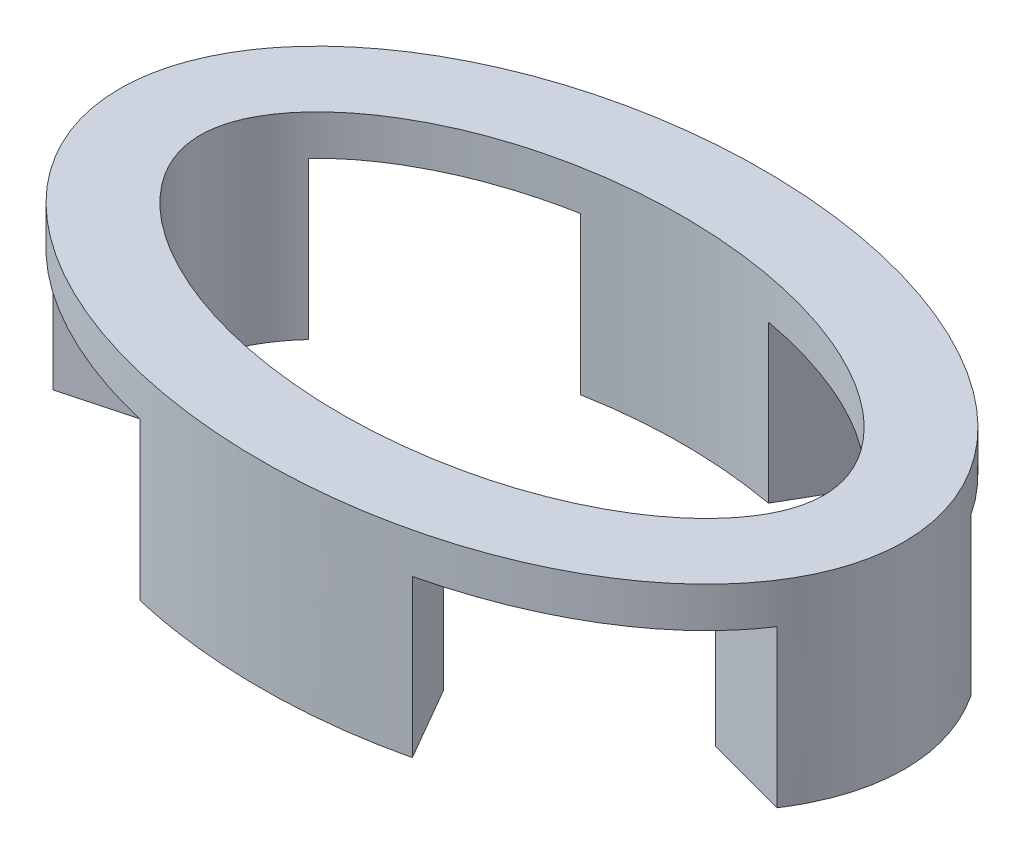
ISO-10303-21;
HEADER;
FILE_DESCRIPTION(('STEP AP214'),'2;1');
FILE_NAME('part.step','',(''),(''),'','','');
FILE_SCHEMA(('AUTOMOTIVE_DESIGN { 1 0 10303 214 1 1 1 1 }'));
ENDSEC;
DATA;
#1=APPLICATION_CONTEXT('core data for automotive mechanical design processes');
#2=APPLICATION_PROTOCOL_DEFINITION('international standard','automotive_design',2000,#1);
#3=PRODUCT_CONTEXT('',#1,'mechanical');
#4=PRODUCT('Part','Part','',(#3));
#5=PRODUCT_RELATED_PRODUCT_CATEGORY('part','',(#4));
#6=PRODUCT_DEFINITION_FORMATION('','',#4);
#7=PRODUCT_DEFINITION_CONTEXT('part definition',#1,'design');
#8=PRODUCT_DEFINITION('design','',#6,#7);
#9=PRODUCT_DEFINITION_SHAPE('','',#8);
#10=(LENGTH_UNIT() NAMED_UNIT(*) SI_UNIT(.MILLI.,.METRE.));
#11=(NAMED_UNIT(*) PLANE_ANGLE_UNIT() SI_UNIT($,.RADIAN.));
#12=(NAMED_UNIT(*) SI_UNIT($,.STERADIAN.) SOLID_ANGLE_UNIT());
#13=UNCERTAINTY_MEASURE_WITH_UNIT(LENGTH_MEASURE(1.E-05),#10,'distance_accuracy_value','');
#14=(GEOMETRIC_REPRESENTATION_CONTEXT(3) GLOBAL_UNCERTAINTY_ASSIGNED_CONTEXT((#13)) GLOBAL_UNIT_ASSIGNED_CONTEXT((#10,
#11,#12)) REPRESENTATION_CONTEXT('',''));
#15=CARTESIAN_POINT('',(0.,0.,0.));
#16=DIRECTION('',(0.,0.,1.));
#17=DIRECTION('',(1.,0.,0.));
#18=AXIS2_PLACEMENT_3D('',#15,#16,#17);
#19=CARTESIAN_POINT('',(0.,3.,0.));
#20=DIRECTION('',(0.,1.,0.));
#21=DIRECTION('',(1.,0.,0.));
#22=AXIS2_PLACEMENT_3D('',#19,#20,#21);
#23=ELLIPSE('',#22,97.5,62.5);
#24=DIRECTION('',(0.,-1.,0.));
#25=VECTOR('',#24,1.);
#26=SURFACE_OF_LINEAR_EXTRUSION('',#23,#25);
#27=CARTESIAN_POINT('',(0.,-3.,0.));
#28=DIRECTION('',(0.,1.,0.));
#29=DIRECTION('',(1.,0.,0.));
#30=AXIS2_PLACEMENT_3D('',#27,#28,#29);
#31=ELLIPSE('',#30,97.5,62.5);
#32=CARTESIAN_POINT('',(97.5,-3.,0.));
#33=VERTEX_POINT('',#32);
#34=EDGE_CURVE('E256',#33,#33,#31,.T.);
#35=ORIENTED_EDGE('',*,*,#34,.F.);
#36=EDGE_LOOP('',(#35));
#37=FACE_BOUND('',#36,.T.);
#38=DIRECTION('',(0.,-1.,0.));
#39=VECTOR('',#38,1.);
#40=CARTESIAN_POINT('',(33.8411131991807,-13.,-58.6145274456705));
#41=LINE('',#40,#39);
#42=CARTESIAN_POINT('',(33.8411131991807,-13.,-58.6145274456705));
#43=VERTEX_POINT('',#42);
#44=CARTESIAN_POINT('',(33.8411131991807,-52.,-58.6145274456705));
#45=VERTEX_POINT('',#44);
#46=EDGE_CURVE('E164',#43,#45,#41,.T.);
#47=ORIENTED_EDGE('',*,*,#46,.T.);
#48=CARTESIAN_POINT('',(0.,-52.,0.));
#49=DIRECTION('',(0.,-1.,0.));
#50=DIRECTION('',(1.,0.,0.));
#51=AXIS2_PLACEMENT_3D('',#48,#49,#50);
#52=ELLIPSE('',#51,97.5,62.5);
#53=CARTESIAN_POINT('',(-33.8411131991807,-52.,-58.6145274456705));
#54=VERTEX_POINT('',#53);
#55=EDGE_CURVE('E557',#54,#45,#52,.T.);
#56=ORIENTED_EDGE('',*,*,#55,.F.);
#57=DIRECTION('',(0.,-1.,0.));
#58=VECTOR('',#57,1.);
#59=CARTESIAN_POINT('',(-33.8411131991807,-13.,-58.6145274456705));
#60=LINE('',#59,#58);
#61=CARTESIAN_POINT('',(-33.8411131991807,-13.,-58.6145274456705));
#62=VERTEX_POINT('',#61);
#63=EDGE_CURVE('E192',#62,#54,#60,.T.);
#64=ORIENTED_EDGE('',*,*,#63,.F.);
#65=CARTESIAN_POINT('',(0.,-13.,0.));
#66=DIRECTION('',(0.,1.,0.));
#67=DIRECTION('',(1.,0.,0.));
#68=AXIS2_PLACEMENT_3D('',#65,#66,#67);
#69=ELLIPSE('',#68,97.5,62.5);
#70=CARTESIAN_POINT('',(-89.9573349148752,-13.,-24.1039952436969));
#71=VERTEX_POINT('',#70);
#72=EDGE_CURVE('E199',#71,#62,#69,.F.);
#73=ORIENTED_EDGE('',*,*,#72,.F.);
#74=DIRECTION('',(0.,-1.,0.));
#75=VECTOR('',#74,1.);
#76=CARTESIAN_POINT('',(-89.9573349148752,-27.5,-24.1039952436969));
#77=LINE('',#76,#75);
#78=CARTESIAN_POINT('',(-89.9573349148752,-52.,-24.1039952436969));
#79=VERTEX_POINT('',#78);
#80=EDGE_CURVE('E202',#71,#79,#77,.T.);
#81=ORIENTED_EDGE('',*,*,#80,.T.);
#82=CARTESIAN_POINT('',(-89.9573349148752,-52.,24.1039952436969));
#83=VERTEX_POINT('',#82);
#84=EDGE_CURVE('E333',#83,#79,#52,.T.);
#85=ORIENTED_EDGE('',*,*,#84,.F.);
#86=DIRECTION('',(0.,-1.,0.));
#87=VECTOR('',#86,1.);
#88=CARTESIAN_POINT('',(-89.9573349148752,-27.5,24.1039952436969));
#89=LINE('',#88,#87);
#90=CARTESIAN_POINT('',(-89.9573349148752,-13.,24.1039952436969));
#91=VERTEX_POINT('',#90);
#92=EDGE_CURVE('E229',#91,#83,#89,.T.);
#93=ORIENTED_EDGE('',*,*,#92,.F.);
#94=CARTESIAN_POINT('',(0.,-13.,0.));
#95=DIRECTION('',(0.,1.,0.));
#96=DIRECTION('',(1.,0.,0.));
#97=AXIS2_PLACEMENT_3D('',#94,#95,#96);
#98=ELLIPSE('',#97,97.5,62.5);
#99=CARTESIAN_POINT('',(-33.8411131991807,-13.,58.6145274456705));
#100=VERTEX_POINT('',#99);
#101=EDGE_CURVE('E226',#100,#91,#98,.F.);
#102=ORIENTED_EDGE('',*,*,#101,.F.);
#103=DIRECTION('',(0.,-1.,0.));
#104=VECTOR('',#103,1.);
#105=CARTESIAN_POINT('',(-33.8411131991807,-13.,58.6145274456705));
#106=LINE('',#105,#104);
#107=CARTESIAN_POINT('',(-33.8411131991807,-52.,58.6145274456705));
#108=VERTEX_POINT('',#107);
#109=EDGE_CURVE('E216',#100,#108,#106,.T.);
#110=ORIENTED_EDGE('',*,*,#109,.T.);
#111=CARTESIAN_POINT('',(33.8411131991807,-52.,58.6145274456705));
#112=VERTEX_POINT('',#111);
#113=EDGE_CURVE('E396',#112,#108,#52,.T.);
#114=ORIENTED_EDGE('',*,*,#113,.F.);
#115=DIRECTION('',(0.,-1.,0.));
#116=VECTOR('',#115,1.);
#117=CARTESIAN_POINT('',(33.8411131991807,-13.,58.6145274456705));
#118=LINE('',#117,#116);
#119=CARTESIAN_POINT('',(33.8411131991807,-13.,58.6145274456705));
#120=VERTEX_POINT('',#119);
#121=EDGE_CURVE('E241',#120,#112,#118,.T.);
#122=ORIENTED_EDGE('',*,*,#121,.F.);
#123=CARTESIAN_POINT('',(0.,-13.,0.));
#124=DIRECTION('',(0.,1.,0.));
#125=DIRECTION('',(1.,0.,0.));
#126=AXIS2_PLACEMENT_3D('',#123,#124,#125);
#127=ELLIPSE('',#126,97.5,62.5);
#128=CARTESIAN_POINT('',(89.9573349148752,-13.,24.1039952436969));
#129=VERTEX_POINT('',#128);
#130=EDGE_CURVE('E249',#129,#120,#127,.F.);
#131=ORIENTED_EDGE('',*,*,#130,.F.);
#132=DIRECTION('',(0.,-1.,0.));
#133=VECTOR('',#132,1.);
#134=CARTESIAN_POINT('',(89.9573349148752,-27.5,24.1039952436969));
#135=LINE('',#134,#133);
#136=CARTESIAN_POINT('',(89.9573349148752,-52.,24.1039952436969));
#137=VERTEX_POINT('',#136);
#138=EDGE_CURVE('E252',#129,#137,#135,.T.);
#139=ORIENTED_EDGE('',*,*,#138,.T.);
#140=CARTESIAN_POINT('',(89.9573349148752,-52.,-24.1039952436969));
#141=VERTEX_POINT('',#140);
#142=EDGE_CURVE('E268',#141,#137,#52,.T.);
#143=ORIENTED_EDGE('',*,*,#142,.F.);
#144=DIRECTION('',(0.,-1.,0.));
#145=VECTOR('',#144,1.);
#146=CARTESIAN_POINT('',(89.9573349148752,-27.5,-24.1039952436969));
#147=LINE('',#146,#145);
#148=CARTESIAN_POINT('',(89.9573349148752,-13.,-24.1039952436969));
#149=VERTEX_POINT('',#148);
#150=EDGE_CURVE('E177',#149,#141,#147,.T.);
#151=ORIENTED_EDGE('',*,*,#150,.F.);
#152=CARTESIAN_POINT('',(0.,-13.,0.));
#153=DIRECTION('',(0.,1.,0.));
#154=DIRECTION('',(1.,0.,0.));
#155=AXIS2_PLACEMENT_3D('',#152,#153,#154);
#156=ELLIPSE('',#155,97.5,62.5);
#157=EDGE_CURVE('E159',#43,#149,#156,.F.);
#158=ORIENTED_EDGE('',*,*,#157,.F.);
#159=EDGE_LOOP('',(#47,#56,#64,#73,#81,#85,#93,#102,#110,#114,#122,#131,#139,#143,#151,#158));
#160=FACE_BOUND('',#159,.T.);
#161=ADVANCED_FACE('F43',(#37,#160),#26,.F.);
#162=CARTESIAN_POINT('',(0.,-52.,0.));
#163=DIRECTION('',(0.,-1.,0.));
#164=DIRECTION('',(0.,0.,-1.));
#165=AXIS2_PLACEMENT_3D('',#162,#163,#164);
#166=PLANE('',#165);
#167=ORIENTED_EDGE('',*,*,#55,.T.);
#168=DIRECTION('',(-0.500000000000001,0.,0.866025403784438));
#169=VECTOR('',#168,1.);
#170=CARTESIAN_POINT('',(33.8411131991807,-52.,-58.6145274456705));
#171=LINE('',#170,#169);
#172=CARTESIAN_POINT('',(23.3195355276156,-52.,-40.3906203427376));
#173=VERTEX_POINT('',#172);
#174=EDGE_CURVE('E169',#45,#173,#171,.T.);
#175=ORIENTED_EDGE('',*,*,#174,.T.);
#176=CARTESIAN_POINT('',(77.5,-52.,0.));
#177=CARTESIAN_POINT('',(77.5,-52.,2.05153029392787));
#178=CARTESIAN_POINT('',(76.896839649338,-52.,6.15459088178361));
#179=CARTESIAN_POINT('',(73.7614064019966,-52.,12.9769434983319));
#180=CARTESIAN_POINT('',(67.7379482689495,-52.,20.3167028975504));
#181=CARTESIAN_POINT('',(58.621429311724,-52.,27.5010369489446));
#182=CARTESIAN_POINT('',(46.6738677118328,-52.,33.8186955759619));
#183=CARTESIAN_POINT('',(27.7018251632302,-52.,40.3508722503388));
#184=CARTESIAN_POINT('',(0.,-52.,43.9327518331075));
#185=CARTESIAN_POINT('',(-27.7018251632302,-52.,40.3508722503388));
#186=CARTESIAN_POINT('',(-46.6738677118328,-52.,33.8186955759619));
#187=CARTESIAN_POINT('',(-58.621429311724,-52.,27.5010369489445));
#188=CARTESIAN_POINT('',(-67.7379482689496,-52.,20.3167028975504));
#189=CARTESIAN_POINT('',(-73.7614064019966,-52.,12.9769434983319));
#190=CARTESIAN_POINT('',(-76.896839649338,-52.,6.15459088178362));
#191=CARTESIAN_POINT('',(-77.801580175331,-52.,0.));
#192=CARTESIAN_POINT('',(-76.896839649338,-52.,-6.15459088178361));
#193=CARTESIAN_POINT('',(-73.7614064019966,-52.,-12.9769434983319));
#194=CARTESIAN_POINT('',(-67.7379482689496,-52.,-20.3167028975503));
#195=CARTESIAN_POINT('',(-58.6214293117241,-52.,-27.5010369489446));
#196=CARTESIAN_POINT('',(-46.6738677118328,-52.,-33.8186955759618));
#197=CARTESIAN_POINT('',(-27.7018251632302,-52.,-40.3508722503388));
#198=CARTESIAN_POINT('',(0.,-52.,-43.9327518331075));
#199=CARTESIAN_POINT('',(27.7018251632302,-52.,-40.3508722503388));
#200=CARTESIAN_POINT('',(46.6738677118328,-52.,-33.8186955759619));
#201=CARTESIAN_POINT('',(58.621429311724,-52.,-27.5010369489446));
#202=CARTESIAN_POINT('',(67.7379482689495,-52.,-20.3167028975504));
#203=CARTESIAN_POINT('',(73.7614064019966,-52.,-12.9769434983319));
#204=CARTESIAN_POINT('',(76.8968396493379,-52.,-6.15459088178363));
#205=CARTESIAN_POINT('',(77.5,-52.,-2.05153029392788));
#206=CARTESIAN_POINT('',(77.5,-52.,0.));
#207=B_SPLINE_CURVE_WITH_KNOTS('',3,(#176,#177,#178,#179,#180,#181,#182,#183,#184,#185,#186,
#187,#188,#189,#190,#191,#192,#193,#194,#195,#196,#197,#198,#199,#200,#201,#202,#203,#204,#205,
#206),.UNSPECIFIED.,.T.,.F.,(4,1,1,1,1,1,1,1,1,1,1,1,1,1,1,1,1,1,1,1,1,1,1,1,1,1,1,1,4),(0.,
0.196349540849362,0.392699081698724,0.589048622548086,0.785398163397448,0.98174770424681,
1.17809724509617,1.5707963267949,1.96349540849362,2.15984494934298,2.35619449019234,
2.55254403104171,2.74889357189107,2.94524311274043,3.14159265358979,3.33794219443916,
3.53429173528852,3.73064127613788,3.92699081698724,4.1233403578366,4.31968989868597,
4.71238898038469,5.10508806208341,5.30143760293278,5.49778714378214,5.6941366846315,
5.89048622548086,6.08683576633022,6.28318530717959),.UNSPECIFIED.);
#208=CARTESIAN_POINT('',(-23.3195355288909,-52.,-40.3906203449464));
#209=VERTEX_POINT('',#208);
#210=EDGE_CURVE('E310',#209,#173,#207,.T.);
#211=ORIENTED_EDGE('',*,*,#210,.F.);
#212=DIRECTION('',(0.500000000000001,0.,0.866025403784438));
#213=VECTOR('',#212,1.);
#214=CARTESIAN_POINT('',(-33.8411131991807,-52.,-58.6145274456705));
#215=LINE('',#214,#213);
#216=EDGE_CURVE('E181',#54,#209,#215,.T.);
#217=ORIENTED_EDGE('',*,*,#216,.F.);
#218=EDGE_LOOP('',(#167,#175,#211,#217));
#219=FACE_BOUND('',#218,.T.);
#220=ADVANCED_FACE('F289',(#219),#166,.T.);
#221=CARTESIAN_POINT('',(69.0028461434898,-52.,-18.4892568995971));
#222=VERTEX_POINT('',#221);
#223=CARTESIAN_POINT('',(69.0028461434898,-52.,18.4892568995971));
#224=VERTEX_POINT('',#223);
#225=EDGE_CURVE('E270',#222,#224,#207,.T.);
#226=ORIENTED_EDGE('',*,*,#225,.F.);
#227=DIRECTION('',(0.965925826289068,0.,-0.258819045102521));
#228=VECTOR('',#227,1.);
#229=CARTESIAN_POINT('',(54.6654774091832,-52.,-14.6475705256524));
#230=LINE('',#229,#228);
#231=EDGE_CURVE('E374',#222,#141,#230,.T.);
#232=ORIENTED_EDGE('',*,*,#231,.T.);
#233=ORIENTED_EDGE('',*,*,#142,.T.);
#234=DIRECTION('',(0.965925826289068,0.,0.258819045102521));
#235=VECTOR('',#234,1.);
#236=CARTESIAN_POINT('',(54.6654774091832,-52.,14.6475705256524));
#237=LINE('',#236,#235);
#238=EDGE_CURVE('E237',#224,#137,#237,.T.);
#239=ORIENTED_EDGE('',*,*,#238,.F.);
#240=EDGE_LOOP('',(#226,#232,#233,#239));
#241=FACE_BOUND('',#240,.T.);
#242=ADVANCED_FACE('F282',(#241),#166,.T.);
#243=DIRECTION('',(0.,1.,0.));
#244=VECTOR('',#243,1.);
#245=SURFACE_OF_LINEAR_EXTRUSION('',#207,#244);
#246=CARTESIAN_POINT('',(77.5,-3.,0.));
#247=CARTESIAN_POINT('',(77.5,-3.,2.05153029392787));
#248=CARTESIAN_POINT('',(76.896839649338,-3.,6.15459088178361));
#249=CARTESIAN_POINT('',(73.7614064019966,-3.,12.9769434983319));
#250=CARTESIAN_POINT('',(67.7379482689495,-3.,20.3167028975504));
#251=CARTESIAN_POINT('',(58.621429311724,-3.,27.5010369489446));
#252=CARTESIAN_POINT('',(46.6738677118328,-3.,33.8186955759619));
#253=CARTESIAN_POINT('',(27.7018251632302,-3.,40.3508722503388));
#254=CARTESIAN_POINT('',(0.,-3.,43.9327518331075));
#255=CARTESIAN_POINT('',(-27.7018251632302,-3.,40.3508722503388));
#256=CARTESIAN_POINT('',(-46.6738677118328,-3.,33.8186955759619));
#257=CARTESIAN_POINT('',(-58.621429311724,-3.,27.5010369489445));
#258=CARTESIAN_POINT('',(-67.7379482689496,-3.,20.3167028975504));
#259=CARTESIAN_POINT('',(-73.7614064019966,-3.,12.9769434983319));
#260=CARTESIAN_POINT('',(-76.896839649338,-3.,6.15459088178362));
#261=CARTESIAN_POINT('',(-77.801580175331,-3.,0.));
#262=CARTESIAN_POINT('',(-76.896839649338,-3.,-6.15459088178361));
#263=CARTESIAN_POINT('',(-73.7614064019966,-3.,-12.9769434983319));
#264=CARTESIAN_POINT('',(-67.7379482689496,-3.,-20.3167028975503));
#265=CARTESIAN_POINT('',(-58.6214293117241,-3.,-27.5010369489446));
#266=CARTESIAN_POINT('',(-46.6738677118328,-3.,-33.8186955759618));
#267=CARTESIAN_POINT('',(-27.7018251632302,-3.,-40.3508722503388));
#268=CARTESIAN_POINT('',(0.,-3.,-43.9327518331075));
#269=CARTESIAN_POINT('',(27.7018251632302,-3.,-40.3508722503388));
#270=CARTESIAN_POINT('',(46.6738677118328,-3.,-33.8186955759619));
#271=CARTESIAN_POINT('',(58.621429311724,-3.,-27.5010369489446));
#272=CARTESIAN_POINT('',(67.7379482689495,-3.,-20.3167028975504));
#273=CARTESIAN_POINT('',(73.7614064019966,-3.,-12.9769434983319));
#274=CARTESIAN_POINT('',(76.8968396493379,-3.,-6.15459088178363));
#275=CARTESIAN_POINT('',(77.5,-3.,-2.05153029392788));
#276=CARTESIAN_POINT('',(77.5,-3.,0.));
#277=B_SPLINE_CURVE_WITH_KNOTS('',3,(#246,#247,#248,#249,#250,#251,#252,#253,#254,#255,#256,
#257,#258,#259,#260,#261,#262,#263,#264,#265,#266,#267,#268,#269,#270,#271,#272,#273,#274,#275,
#276),.UNSPECIFIED.,.T.,.F.,(4,1,1,1,1,1,1,1,1,1,1,1,1,1,1,1,1,1,1,1,1,1,1,1,1,1,1,1,4),(0.,
0.196349540849362,0.392699081698724,0.589048622548086,0.785398163397448,0.98174770424681,
1.17809724509617,1.5707963267949,1.96349540849362,2.15984494934298,2.35619449019234,
2.55254403104171,2.74889357189107,2.94524311274043,3.14159265358979,3.33794219443916,
3.53429173528852,3.73064127613788,3.92699081698724,4.1233403578366,4.31968989868597,
4.71238898038469,5.10508806208341,5.30143760293278,5.49778714378214,5.6941366846315,
5.89048622548086,6.08683576633022,6.28318530717959),.UNSPECIFIED.);
#278=CARTESIAN_POINT('',(77.5,-3.,0.));
#279=VERTEX_POINT('',#278);
#280=EDGE_CURVE('E260',#279,#279,#277,.T.);
#281=ORIENTED_EDGE('',*,*,#280,.F.);
#282=EDGE_LOOP('',(#281));
#283=FACE_BOUND('',#282,.T.);
#284=ORIENTED_EDGE('',*,*,#210,.T.);
#285=DIRECTION('',(0.,1.,0.));
#286=VECTOR('',#285,1.);
#287=CARTESIAN_POINT('',(23.3195355268599,-52.,-40.3906203414288));
#288=LINE('',#287,#286);
#289=CARTESIAN_POINT('',(23.3195355276156,-13.,-40.3906203427376));
#290=VERTEX_POINT('',#289);
#291=EDGE_CURVE('E11',#173,#290,#288,.T.);
#292=ORIENTED_EDGE('',*,*,#291,.T.);
#293=CARTESIAN_POINT('',(77.5,-13.,0.));
#294=CARTESIAN_POINT('',(77.5,-13.,2.05153029392787));
#295=CARTESIAN_POINT('',(76.896839649338,-13.,6.15459088178361));
#296=CARTESIAN_POINT('',(73.7614064019966,-13.,12.9769434983319));
#297=CARTESIAN_POINT('',(67.7379482689495,-13.,20.3167028975504));
#298=CARTESIAN_POINT('',(58.621429311724,-13.,27.5010369489446));
#299=CARTESIAN_POINT('',(46.6738677118328,-13.,33.8186955759619));
#300=CARTESIAN_POINT('',(27.7018251632302,-13.,40.3508722503388));
#301=CARTESIAN_POINT('',(0.,-13.,43.9327518331075));
#302=CARTESIAN_POINT('',(-27.7018251632302,-13.,40.3508722503388));
#303=CARTESIAN_POINT('',(-46.6738677118328,-13.,33.8186955759619));
#304=CARTESIAN_POINT('',(-58.621429311724,-13.,27.5010369489445));
#305=CARTESIAN_POINT('',(-67.7379482689496,-13.,20.3167028975504));
#306=CARTESIAN_POINT('',(-73.7614064019966,-13.,12.9769434983319));
#307=CARTESIAN_POINT('',(-76.896839649338,-13.,6.15459088178362));
#308=CARTESIAN_POINT('',(-77.801580175331,-13.,0.));
#309=CARTESIAN_POINT('',(-76.896839649338,-13.,-6.15459088178361));
#310=CARTESIAN_POINT('',(-73.7614064019966,-13.,-12.9769434983319));
#311=CARTESIAN_POINT('',(-67.7379482689496,-13.,-20.3167028975503));
#312=CARTESIAN_POINT('',(-58.6214293117241,-13.,-27.5010369489446));
#313=CARTESIAN_POINT('',(-46.6738677118328,-13.,-33.8186955759618));
#314=CARTESIAN_POINT('',(-27.7018251632302,-13.,-40.3508722503388));
#315=CARTESIAN_POINT('',(0.,-13.,-43.9327518331075));
#316=CARTESIAN_POINT('',(27.7018251632302,-13.,-40.3508722503388));
#317=CARTESIAN_POINT('',(46.6738677118328,-13.,-33.8186955759619));
#318=CARTESIAN_POINT('',(58.621429311724,-13.,-27.5010369489446));
#319=CARTESIAN_POINT('',(67.7379482689495,-13.,-20.3167028975504));
#320=CARTESIAN_POINT('',(73.7614064019966,-13.,-12.9769434983319));
#321=CARTESIAN_POINT('',(76.8968396493379,-13.,-6.15459088178363));
#322=CARTESIAN_POINT('',(77.5,-13.,-2.05153029392788));
#323=CARTESIAN_POINT('',(77.5,-13.,0.));
#324=B_SPLINE_CURVE_WITH_KNOTS('',3,(#293,#294,#295,#296,#297,#298,#299,#300,#301,#302,#303,
#304,#305,#306,#307,#308,#309,#310,#311,#312,#313,#314,#315,#316,#317,#318,#319,#320,#321,#322,
#323),.UNSPECIFIED.,.T.,.F.,(4,1,1,1,1,1,1,1,1,1,1,1,1,1,1,1,1,1,1,1,1,1,1,1,1,1,1,1,4),(0.,
0.196349540849362,0.392699081698724,0.589048622548086,0.785398163397448,0.98174770424681,
1.17809724509617,1.5707963267949,1.96349540849362,2.15984494934298,2.35619449019234,
2.55254403104171,2.74889357189107,2.94524311274043,3.14159265358979,3.33794219443916,
3.53429173528852,3.73064127613788,3.92699081698724,4.1233403578366,4.31968989868597,
4.71238898038469,5.10508806208341,5.30143760293278,5.49778714378214,5.6941366846315,
5.89048622548086,6.08683576633022,6.28318530717959),.UNSPECIFIED.);
#325=CARTESIAN_POINT('',(69.0028461434896,-13.,-18.4892568995977));
#326=VERTEX_POINT('',#325);
#327=EDGE_CURVE('E161',#290,#326,#324,.T.);
#328=ORIENTED_EDGE('',*,*,#327,.T.);
#329=DIRECTION('',(0.,1.,0.));
#330=VECTOR('',#329,1.);
#331=CARTESIAN_POINT('',(69.0028461434901,-52.,-18.4892568995972));
#332=LINE('',#331,#330);
#333=EDGE_CURVE('E52',#326,#222,#332,.F.);
#334=ORIENTED_EDGE('',*,*,#333,.T.);
#335=ORIENTED_EDGE('',*,*,#225,.T.);
#336=DIRECTION('',(0.,1.,0.));
#337=VECTOR('',#336,1.);
#338=CARTESIAN_POINT('',(69.0028461434901,-52.,18.4892568995972));
#339=LINE('',#338,#337);
#340=CARTESIAN_POINT('',(69.0028461434898,-13.,18.4892568995971));
#341=VERTEX_POINT('',#340);
#342=EDGE_CURVE('E377',#341,#224,#339,.F.);
#343=ORIENTED_EDGE('',*,*,#342,.F.);
#344=CARTESIAN_POINT('',(77.5,-13.,0.));
#345=CARTESIAN_POINT('',(77.5,-13.,2.05153029392787));
#346=CARTESIAN_POINT('',(76.896839649338,-13.,6.15459088178361));
#347=CARTESIAN_POINT('',(73.7614064019966,-13.,12.9769434983319));
#348=CARTESIAN_POINT('',(67.7379482689495,-13.,20.3167028975504));
#349=CARTESIAN_POINT('',(58.621429311724,-13.,27.5010369489446));
#350=CARTESIAN_POINT('',(46.6738677118328,-13.,33.8186955759619));
#351=CARTESIAN_POINT('',(27.7018251632302,-13.,40.3508722503388));
#352=CARTESIAN_POINT('',(0.,-13.,43.9327518331075));
#353=CARTESIAN_POINT('',(-27.7018251632302,-13.,40.3508722503388));
#354=CARTESIAN_POINT('',(-46.6738677118328,-13.,33.8186955759619));
#355=CARTESIAN_POINT('',(-58.621429311724,-13.,27.5010369489445));
#356=CARTESIAN_POINT('',(-67.7379482689496,-13.,20.3167028975504));
#357=CARTESIAN_POINT('',(-73.7614064019966,-13.,12.9769434983319));
#358=CARTESIAN_POINT('',(-76.896839649338,-13.,6.15459088178362));
#359=CARTESIAN_POINT('',(-77.801580175331,-13.,0.));
#360=CARTESIAN_POINT('',(-76.896839649338,-13.,-6.15459088178361));
#361=CARTESIAN_POINT('',(-73.7614064019966,-13.,-12.9769434983319));
#362=CARTESIAN_POINT('',(-67.7379482689496,-13.,-20.3167028975503));
#363=CARTESIAN_POINT('',(-58.6214293117241,-13.,-27.5010369489446));
#364=CARTESIAN_POINT('',(-46.6738677118328,-13.,-33.8186955759618));
#365=CARTESIAN_POINT('',(-27.7018251632302,-13.,-40.3508722503388));
#366=CARTESIAN_POINT('',(0.,-13.,-43.9327518331075));
#367=CARTESIAN_POINT('',(27.7018251632302,-13.,-40.3508722503388));
#368=CARTESIAN_POINT('',(46.6738677118328,-13.,-33.8186955759619));
#369=CARTESIAN_POINT('',(58.621429311724,-13.,-27.5010369489446));
#370=CARTESIAN_POINT('',(67.7379482689495,-13.,-20.3167028975504));
#371=CARTESIAN_POINT('',(73.7614064019966,-13.,-12.9769434983319));
#372=CARTESIAN_POINT('',(76.8968396493379,-13.,-6.15459088178363));
#373=CARTESIAN_POINT('',(77.5,-13.,-2.05153029392788));
#374=CARTESIAN_POINT('',(77.5,-13.,0.));
#375=B_SPLINE_CURVE_WITH_KNOTS('',3,(#344,#345,#346,#347,#348,#349,#350,#351,#352,#353,#354,
#355,#356,#357,#358,#359,#360,#361,#362,#363,#364,#365,#366,#367,#368,#369,#370,#371,#372,#373,
#374),.UNSPECIFIED.,.T.,.F.,(4,1,1,1,1,1,1,1,1,1,1,1,1,1,1,1,1,1,1,1,1,1,1,1,1,1,1,1,4),(0.,
0.196349540849362,0.392699081698724,0.589048622548086,0.785398163397448,0.98174770424681,
1.17809724509617,1.5707963267949,1.96349540849362,2.15984494934298,2.35619449019234,
2.55254403104171,2.74889357189107,2.94524311274043,3.14159265358979,3.33794219443916,
3.53429173528852,3.73064127613788,3.92699081698724,4.1233403578366,4.31968989868597,
4.71238898038469,5.10508806208341,5.30143760293278,5.49778714378214,5.6941366846315,
5.89048622548086,6.08683576633022,6.28318530717959),.UNSPECIFIED.);
#376=CARTESIAN_POINT('',(23.3195355312932,-13.,40.3906203406143));
#377=VERTEX_POINT('',#376);
#378=EDGE_CURVE('E393',#341,#377,#375,.T.);
#379=ORIENTED_EDGE('',*,*,#378,.T.);
#380=DIRECTION('',(0.,1.,0.));
#381=VECTOR('',#380,1.);
#382=CARTESIAN_POINT('',(23.3195355268599,-52.,40.3906203414288));
#383=LINE('',#382,#381);
#384=CARTESIAN_POINT('',(23.3195355276156,-52.,40.3906203427376));
#385=VERTEX_POINT('',#384);
#386=EDGE_CURVE('E389',#385,#377,#383,.T.);
#387=ORIENTED_EDGE('',*,*,#386,.F.);
#388=CARTESIAN_POINT('',(-23.3195355288909,-52.,40.3906203449464));
#389=VERTEX_POINT('',#388);
#390=EDGE_CURVE('E261',#385,#389,#207,.T.);
#391=ORIENTED_EDGE('',*,*,#390,.T.);
#392=DIRECTION('',(0.,1.,0.));
#393=VECTOR('',#392,1.);
#394=CARTESIAN_POINT('',(-23.31953552686,-52.,40.3906203414288));
#395=LINE('',#394,#393);
#396=CARTESIAN_POINT('',(-23.3195355288909,-13.,40.3906203449464));
#397=VERTEX_POINT('',#396);
#398=EDGE_CURVE('E349',#389,#397,#395,.T.);
#399=ORIENTED_EDGE('',*,*,#398,.T.);
#400=CARTESIAN_POINT('',(77.5,-13.,0.));
#401=CARTESIAN_POINT('',(77.5,-13.,2.05153029392787));
#402=CARTESIAN_POINT('',(76.896839649338,-13.,6.15459088178361));
#403=CARTESIAN_POINT('',(73.7614064019966,-13.,12.9769434983319));
#404=CARTESIAN_POINT('',(67.7379482689495,-13.,20.3167028975504));
#405=CARTESIAN_POINT('',(58.621429311724,-13.,27.5010369489446));
#406=CARTESIAN_POINT('',(46.6738677118328,-13.,33.8186955759619));
#407=CARTESIAN_POINT('',(27.7018251632302,-13.,40.3508722503388));
#408=CARTESIAN_POINT('',(0.,-13.,43.9327518331075));
#409=CARTESIAN_POINT('',(-27.7018251632302,-13.,40.3508722503388));
#410=CARTESIAN_POINT('',(-46.6738677118328,-13.,33.8186955759619));
#411=CARTESIAN_POINT('',(-58.621429311724,-13.,27.5010369489445));
#412=CARTESIAN_POINT('',(-67.7379482689496,-13.,20.3167028975504));
#413=CARTESIAN_POINT('',(-73.7614064019966,-13.,12.9769434983319));
#414=CARTESIAN_POINT('',(-76.896839649338,-13.,6.15459088178362));
#415=CARTESIAN_POINT('',(-77.801580175331,-13.,0.));
#416=CARTESIAN_POINT('',(-76.896839649338,-13.,-6.15459088178361));
#417=CARTESIAN_POINT('',(-73.7614064019966,-13.,-12.9769434983319));
#418=CARTESIAN_POINT('',(-67.7379482689496,-13.,-20.3167028975503));
#419=CARTESIAN_POINT('',(-58.6214293117241,-13.,-27.5010369489446));
#420=CARTESIAN_POINT('',(-46.6738677118328,-13.,-33.8186955759618));
#421=CARTESIAN_POINT('',(-27.7018251632302,-13.,-40.3508722503388));
#422=CARTESIAN_POINT('',(0.,-13.,-43.9327518331075));
#423=CARTESIAN_POINT('',(27.7018251632302,-13.,-40.3508722503388));
#424=CARTESIAN_POINT('',(46.6738677118328,-13.,-33.8186955759619));
#425=CARTESIAN_POINT('',(58.621429311724,-13.,-27.5010369489446));
#426=CARTESIAN_POINT('',(67.7379482689495,-13.,-20.3167028975504));
#427=CARTESIAN_POINT('',(73.7614064019966,-13.,-12.9769434983319));
#428=CARTESIAN_POINT('',(76.8968396493379,-13.,-6.15459088178363));
#429=CARTESIAN_POINT('',(77.5,-13.,-2.05153029392788));
#430=CARTESIAN_POINT('',(77.5,-13.,0.));
#431=B_SPLINE_CURVE_WITH_KNOTS('',3,(#400,#401,#402,#403,#404,#405,#406,#407,#408,#409,#410,
#411,#412,#413,#414,#415,#416,#417,#418,#419,#420,#421,#422,#423,#424,#425,#426,#427,#428,#429,
#430),.UNSPECIFIED.,.T.,.F.,(4,1,1,1,1,1,1,1,1,1,1,1,1,1,1,1,1,1,1,1,1,1,1,1,1,1,1,1,4),(0.,
0.196349540849362,0.392699081698724,0.589048622548086,0.785398163397448,0.98174770424681,
1.17809724509617,1.5707963267949,1.96349540849362,2.15984494934298,2.35619449019234,
2.55254403104171,2.74889357189107,2.94524311274043,3.14159265358979,3.33794219443916,
3.53429173528852,3.73064127613788,3.92699081698724,4.1233403578366,4.31968989868597,
4.71238898038469,5.10508806208341,5.30143760293278,5.49778714378214,5.6941366846315,
5.89048622548086,6.08683576633022,6.28318530717959),.UNSPECIFIED.);
#432=CARTESIAN_POINT('',(-69.0028461488652,-13.,18.4892568938514));
#433=VERTEX_POINT('',#432);
#434=EDGE_CURVE('E408',#397,#433,#431,.T.);
#435=ORIENTED_EDGE('',*,*,#434,.T.);
#436=DIRECTION('',(0.,1.,0.));
#437=VECTOR('',#436,1.);
#438=CARTESIAN_POINT('',(-69.0028461434901,-52.,18.4892568995972));
#439=LINE('',#438,#437);
#440=CARTESIAN_POINT('',(-69.0028461470687,-52.,18.4892569005561));
#441=VERTEX_POINT('',#440);
#442=EDGE_CURVE('E329',#433,#441,#439,.F.);
#443=ORIENTED_EDGE('',*,*,#442,.T.);
#444=CARTESIAN_POINT('',(-69.0028461470687,-52.,-18.4892569005561));
#445=VERTEX_POINT('',#444);
#446=EDGE_CURVE('E269',#441,#445,#207,.T.);
#447=ORIENTED_EDGE('',*,*,#446,.T.);
#448=DIRECTION('',(0.,1.,0.));
#449=VECTOR('',#448,1.);
#450=CARTESIAN_POINT('',(-69.0028461434901,-52.,-18.4892568995972));
#451=LINE('',#450,#449);
#452=CARTESIAN_POINT('',(-69.0028461470687,-13.,-18.4892569005561));
#453=VERTEX_POINT('',#452);
#454=EDGE_CURVE('E326',#453,#445,#451,.F.);
#455=ORIENTED_EDGE('',*,*,#454,.F.);
#456=CARTESIAN_POINT('',(77.5,-13.,0.));
#457=CARTESIAN_POINT('',(77.5,-13.,2.05153029392787));
#458=CARTESIAN_POINT('',(76.896839649338,-13.,6.15459088178361));
#459=CARTESIAN_POINT('',(73.7614064019966,-13.,12.9769434983319));
#460=CARTESIAN_POINT('',(67.7379482689495,-13.,20.3167028975504));
#461=CARTESIAN_POINT('',(58.621429311724,-13.,27.5010369489446));
#462=CARTESIAN_POINT('',(46.6738677118328,-13.,33.8186955759619));
#463=CARTESIAN_POINT('',(27.7018251632302,-13.,40.3508722503388));
#464=CARTESIAN_POINT('',(0.,-13.,43.9327518331075));
#465=CARTESIAN_POINT('',(-27.7018251632302,-13.,40.3508722503388));
#466=CARTESIAN_POINT('',(-46.6738677118328,-13.,33.8186955759619));
#467=CARTESIAN_POINT('',(-58.621429311724,-13.,27.5010369489445));
#468=CARTESIAN_POINT('',(-67.7379482689496,-13.,20.3167028975504));
#469=CARTESIAN_POINT('',(-73.7614064019966,-13.,12.9769434983319));
#470=CARTESIAN_POINT('',(-76.896839649338,-13.,6.15459088178362));
#471=CARTESIAN_POINT('',(-77.801580175331,-13.,0.));
#472=CARTESIAN_POINT('',(-76.896839649338,-13.,-6.15459088178361));
#473=CARTESIAN_POINT('',(-73.7614064019966,-13.,-12.9769434983319));
#474=CARTESIAN_POINT('',(-67.7379482689496,-13.,-20.3167028975503));
#475=CARTESIAN_POINT('',(-58.6214293117241,-13.,-27.5010369489446));
#476=CARTESIAN_POINT('',(-46.6738677118328,-13.,-33.8186955759618));
#477=CARTESIAN_POINT('',(-27.7018251632302,-13.,-40.3508722503388));
#478=CARTESIAN_POINT('',(0.,-13.,-43.9327518331075));
#479=CARTESIAN_POINT('',(27.7018251632302,-13.,-40.3508722503388));
#480=CARTESIAN_POINT('',(46.6738677118328,-13.,-33.8186955759619));
#481=CARTESIAN_POINT('',(58.621429311724,-13.,-27.5010369489446));
#482=CARTESIAN_POINT('',(67.7379482689495,-13.,-20.3167028975504));
#483=CARTESIAN_POINT('',(73.7614064019966,-13.,-12.9769434983319));
#484=CARTESIAN_POINT('',(76.8968396493379,-13.,-6.15459088178363));
#485=CARTESIAN_POINT('',(77.5,-13.,-2.05153029392788));
#486=CARTESIAN_POINT('',(77.5,-13.,0.));
#487=B_SPLINE_CURVE_WITH_KNOTS('',3,(#456,#457,#458,#459,#460,#461,#462,#463,#464,#465,#466,
#467,#468,#469,#470,#471,#472,#473,#474,#475,#476,#477,#478,#479,#480,#481,#482,#483,#484,#485,
#486),.UNSPECIFIED.,.T.,.F.,(4,1,1,1,1,1,1,1,1,1,1,1,1,1,1,1,1,1,1,1,1,1,1,1,1,1,1,1,4),(0.,
0.196349540849362,0.392699081698724,0.589048622548086,0.785398163397448,0.98174770424681,
1.17809724509617,1.5707963267949,1.96349540849362,2.15984494934298,2.35619449019234,
2.55254403104171,2.74889357189107,2.94524311274043,3.14159265358979,3.33794219443916,
3.53429173528852,3.73064127613788,3.92699081698724,4.1233403578366,4.31968989868597,
4.71238898038469,5.10508806208341,5.30143760293278,5.49778714378214,5.6941366846315,
5.89048622548086,6.08683576633022,6.28318530717959),.UNSPECIFIED.);
#488=CARTESIAN_POINT('',(-23.319535538775,-13.,-40.3906203392398));
#489=VERTEX_POINT('',#488);
#490=EDGE_CURVE('E346',#453,#489,#487,.T.);
#491=ORIENTED_EDGE('',*,*,#490,.T.);
#492=DIRECTION('',(0.,1.,0.));
#493=VECTOR('',#492,1.);
#494=CARTESIAN_POINT('',(-23.3195355268599,-52.,-40.3906203414288));
#495=LINE('',#494,#493);
#496=EDGE_CURVE('E344',#209,#489,#495,.T.);
#497=ORIENTED_EDGE('',*,*,#496,.F.);
#498=EDGE_LOOP('',(#284,#292,#328,#334,#335,#343,#379,#387,#391,#399,#435,#443,#447,#455,#491,#497));
#499=FACE_BOUND('',#498,.T.);
#500=ADVANCED_FACE('F278',(#283,#499),#245,.T.);
#501=DIRECTION('',(-0.965925826289068,0.,-0.258819045102521));
#502=VECTOR('',#501,1.);
#503=CARTESIAN_POINT('',(-54.6654774091832,-52.,-14.6475705256524));
#504=LINE('',#503,#502);
#505=EDGE_CURVE('E188',#445,#79,#504,.T.);
#506=ORIENTED_EDGE('',*,*,#505,.F.);
#507=ORIENTED_EDGE('',*,*,#446,.F.);
#508=DIRECTION('',(-0.965925826289068,0.,0.258819045102521));
#509=VECTOR('',#508,1.);
#510=CARTESIAN_POINT('',(-54.6654774091832,-52.,14.6475705256524));
#511=LINE('',#510,#509);
#512=EDGE_CURVE('E206',#441,#83,#511,.T.);
#513=ORIENTED_EDGE('',*,*,#512,.T.);
#514=ORIENTED_EDGE('',*,*,#84,.T.);
#515=EDGE_LOOP('',(#506,#507,#513,#514));
#516=FACE_BOUND('',#515,.T.);
#517=ADVANCED_FACE('F281',(#516),#166,.T.);
#518=ORIENTED_EDGE('',*,*,#113,.T.);
#519=DIRECTION('',(0.500000000000001,0.,-0.866025403784438));
#520=VECTOR('',#519,1.);
#521=CARTESIAN_POINT('',(-33.8411131991807,-52.,58.6145274456705));
#522=LINE('',#521,#520);
#523=EDGE_CURVE('E212',#108,#389,#522,.T.);
#524=ORIENTED_EDGE('',*,*,#523,.T.);
#525=ORIENTED_EDGE('',*,*,#390,.F.);
#526=DIRECTION('',(-0.500000000000001,0.,-0.866025403784438));
#527=VECTOR('',#526,1.);
#528=CARTESIAN_POINT('',(33.8411131991807,-52.,58.6145274456705));
#529=LINE('',#528,#527);
#530=EDGE_CURVE('E232',#112,#385,#529,.T.);
#531=ORIENTED_EDGE('',*,*,#530,.F.);
#532=EDGE_LOOP('',(#518,#524,#525,#531));
#533=FACE_BOUND('',#532,.T.);
#534=ADVANCED_FACE('F286',(#533),#166,.T.);
#535=CARTESIAN_POINT('',(0.,-3.,0.));
#536=DIRECTION('',(0.,1.,0.));
#537=DIRECTION('',(0.,0.,1.));
#538=AXIS2_PLACEMENT_3D('',#535,#536,#537);
#539=PLANE('',#538);
#540=ORIENTED_EDGE('',*,*,#34,.T.);
#541=EDGE_LOOP('',(#540));
#542=FACE_BOUND('',#541,.T.);
#543=ORIENTED_EDGE('',*,*,#280,.T.);
#544=EDGE_LOOP('',(#543));
#545=FACE_BOUND('',#544,.T.);
#546=ADVANCED_FACE('F284',(#542,#545),#539,.T.);
#547=CARTESIAN_POINT('',(54.6654774091832,-13.,14.6475705256524));
#548=DIRECTION('',(0.258819045102521,0.,-0.965925826289068));
#549=DIRECTION('',(-0.965925826289068,0.,-0.258819045102521));
#550=AXIS2_PLACEMENT_3D('',#547,#548,#549);
#551=PLANE('',#550);
#552=DIRECTION('',(0.965925826289068,0.,0.258819045102521));
#553=VECTOR('',#552,1.);
#554=CARTESIAN_POINT('',(54.6654774091832,-13.,14.6475705256524));
#555=LINE('',#554,#553);
#556=EDGE_CURVE('E236',#341,#129,#555,.T.);
#557=ORIENTED_EDGE('',*,*,#556,.F.);
#558=ORIENTED_EDGE('',*,*,#342,.T.);
#559=ORIENTED_EDGE('',*,*,#238,.T.);
#560=ORIENTED_EDGE('',*,*,#138,.F.);
#561=EDGE_LOOP('',(#557,#558,#559,#560));
#562=FACE_BOUND('',#561,.T.);
#563=ADVANCED_FACE('F294',(#562),#551,.F.);
#564=CARTESIAN_POINT('',(0.,-13.,0.));
#565=DIRECTION('',(0.,-1.,0.));
#566=DIRECTION('',(0.,0.,-1.));
#567=AXIS2_PLACEMENT_3D('',#564,#565,#566);
#568=PLANE('',#567);
#569=ORIENTED_EDGE('',*,*,#130,.T.);
#570=DIRECTION('',(-0.500000000000001,0.,-0.866025403784438));
#571=VECTOR('',#570,1.);
#572=CARTESIAN_POINT('',(33.8411131991807,-13.,58.6145274456705));
#573=LINE('',#572,#571);
#574=EDGE_CURVE('E233',#120,#377,#573,.T.);
#575=ORIENTED_EDGE('',*,*,#574,.T.);
#576=ORIENTED_EDGE('',*,*,#378,.F.);
#577=ORIENTED_EDGE('',*,*,#556,.T.);
#578=EDGE_LOOP('',(#569,#575,#576,#577));
#579=FACE_BOUND('',#578,.T.);
#580=ADVANCED_FACE('F383',(#579),#568,.T.);
#581=CARTESIAN_POINT('',(33.8411131991807,-13.,58.6145274456705));
#582=DIRECTION('',(-0.866025403784438,0.,0.500000000000001));
#583=DIRECTION('',(0.500000000000001,0.,0.866025403784438));
#584=AXIS2_PLACEMENT_3D('',#581,#582,#583);
#585=PLANE('',#584);
#586=ORIENTED_EDGE('',*,*,#386,.T.);
#587=ORIENTED_EDGE('',*,*,#574,.F.);
#588=ORIENTED_EDGE('',*,*,#121,.T.);
#589=ORIENTED_EDGE('',*,*,#530,.T.);
#590=EDGE_LOOP('',(#586,#587,#588,#589));
#591=FACE_BOUND('',#590,.T.);
#592=ADVANCED_FACE('F386',(#591),#585,.F.);
#593=CARTESIAN_POINT('',(-54.6654774091832,-13.,14.6475705256524));
#594=DIRECTION('',(0.258819045102521,0.,0.965925826289068));
#595=DIRECTION('',(0.965925826289068,0.,-0.258819045102521));
#596=AXIS2_PLACEMENT_3D('',#593,#594,#595);
#597=PLANE('',#596);
#598=ORIENTED_EDGE('',*,*,#92,.T.);
#599=ORIENTED_EDGE('',*,*,#512,.F.);
#600=ORIENTED_EDGE('',*,*,#442,.F.);
#601=DIRECTION('',(-0.965925826289068,0.,0.258819045102521));
#602=VECTOR('',#601,1.);
#603=CARTESIAN_POINT('',(-54.6654774091832,-13.,14.6475705256524));
#604=LINE('',#603,#602);
#605=EDGE_CURVE('E207',#433,#91,#604,.T.);
#606=ORIENTED_EDGE('',*,*,#605,.T.);
#607=EDGE_LOOP('',(#598,#599,#600,#606));
#608=FACE_BOUND('',#607,.T.);
#609=ADVANCED_FACE('F423',(#608),#597,.T.);
#610=CARTESIAN_POINT('',(0.,-13.,0.));
#611=DIRECTION('',(0.,-1.,0.));
#612=DIRECTION('',(0.,0.,-1.));
#613=AXIS2_PLACEMENT_3D('',#610,#611,#612);
#614=PLANE('',#613);
#615=ORIENTED_EDGE('',*,*,#101,.T.);
#616=ORIENTED_EDGE('',*,*,#605,.F.);
#617=ORIENTED_EDGE('',*,*,#434,.F.);
#618=DIRECTION('',(0.500000000000001,0.,-0.866025403784438));
#619=VECTOR('',#618,1.);
#620=CARTESIAN_POINT('',(-33.8411131991807,-13.,58.6145274456705));
#621=LINE('',#620,#619);
#622=EDGE_CURVE('E211',#100,#397,#621,.T.);
#623=ORIENTED_EDGE('',*,*,#622,.F.);
#624=EDGE_LOOP('',(#615,#616,#617,#623));
#625=FACE_BOUND('',#624,.T.);
#626=ADVANCED_FACE('F417',(#625),#614,.T.);
#627=CARTESIAN_POINT('',(-33.8411131991807,-13.,58.6145274456705));
#628=DIRECTION('',(-0.866025403784438,0.,-0.500000000000001));
#629=DIRECTION('',(-0.500000000000001,0.,0.866025403784438));
#630=AXIS2_PLACEMENT_3D('',#627,#628,#629);
#631=PLANE('',#630);
#632=ORIENTED_EDGE('',*,*,#523,.F.);
#633=ORIENTED_EDGE('',*,*,#109,.F.);
#634=ORIENTED_EDGE('',*,*,#622,.T.);
#635=ORIENTED_EDGE('',*,*,#398,.F.);
#636=EDGE_LOOP('',(#632,#633,#634,#635));
#637=FACE_BOUND('',#636,.T.);
#638=ADVANCED_FACE('F420',(#637),#631,.T.);
#639=CARTESIAN_POINT('',(-54.6654774091832,-13.,-14.6475705256524));
#640=DIRECTION('',(-0.258819045102521,0.,0.965925826289068));
#641=DIRECTION('',(0.965925826289068,0.,0.258819045102521));
#642=AXIS2_PLACEMENT_3D('',#639,#640,#641);
#643=PLANE('',#642);
#644=DIRECTION('',(-0.965925826289068,0.,-0.258819045102521));
#645=VECTOR('',#644,1.);
#646=CARTESIAN_POINT('',(-54.6654774091832,-13.,-14.6475705256524));
#647=LINE('',#646,#645);
#648=EDGE_CURVE('E187',#453,#71,#647,.T.);
#649=ORIENTED_EDGE('',*,*,#648,.F.);
#650=ORIENTED_EDGE('',*,*,#454,.T.);
#651=ORIENTED_EDGE('',*,*,#505,.T.);
#652=ORIENTED_EDGE('',*,*,#80,.F.);
#653=EDGE_LOOP('',(#649,#650,#651,#652));
#654=FACE_BOUND('',#653,.T.);
#655=ADVANCED_FACE('F336',(#654),#643,.F.);
#656=CARTESIAN_POINT('',(0.,-13.,0.));
#657=DIRECTION('',(0.,-1.,0.));
#658=DIRECTION('',(0.,0.,1.));
#659=AXIS2_PLACEMENT_3D('',#656,#657,#658);
#660=PLANE('',#659);
#661=ORIENTED_EDGE('',*,*,#72,.T.);
#662=DIRECTION('',(0.500000000000001,0.,0.866025403784438));
#663=VECTOR('',#662,1.);
#664=CARTESIAN_POINT('',(-33.8411131991807,-13.,-58.6145274456705));
#665=LINE('',#664,#663);
#666=EDGE_CURVE('E67',#62,#489,#665,.T.);
#667=ORIENTED_EDGE('',*,*,#666,.T.);
#668=ORIENTED_EDGE('',*,*,#490,.F.);
#669=ORIENTED_EDGE('',*,*,#648,.T.);
#670=EDGE_LOOP('',(#661,#667,#668,#669));
#671=FACE_BOUND('',#670,.T.);
#672=ADVANCED_FACE('F340',(#671),#660,.T.);
#673=CARTESIAN_POINT('',(-33.8411131991807,-13.,-58.6145274456705));
#674=DIRECTION('',(0.866025403784438,0.,-0.500000000000001));
#675=DIRECTION('',(-0.500000000000001,0.,-0.866025403784438));
#676=AXIS2_PLACEMENT_3D('',#673,#674,#675);
#677=PLANE('',#676);
#678=ORIENTED_EDGE('',*,*,#496,.T.);
#679=ORIENTED_EDGE('',*,*,#666,.F.);
#680=ORIENTED_EDGE('',*,*,#63,.T.);
#681=ORIENTED_EDGE('',*,*,#216,.T.);
#682=EDGE_LOOP('',(#678,#679,#680,#681));
#683=FACE_BOUND('',#682,.T.);
#684=ADVANCED_FACE('F342',(#683),#677,.F.);
#685=CARTESIAN_POINT('',(54.6654774091832,-13.,-14.6475705256524));
#686=DIRECTION('',(-0.258819045102521,0.,-0.965925826289068));
#687=DIRECTION('',(-0.965925826289068,0.,0.258819045102521));
#688=AXIS2_PLACEMENT_3D('',#685,#686,#687);
#689=PLANE('',#688);
#690=ORIENTED_EDGE('',*,*,#150,.T.);
#691=ORIENTED_EDGE('',*,*,#231,.F.);
#692=ORIENTED_EDGE('',*,*,#333,.F.);
#693=DIRECTION('',(0.965925826289068,0.,-0.258819045102521));
#694=VECTOR('',#693,1.);
#695=CARTESIAN_POINT('',(54.6654774091832,-13.,-14.6475705256524));
#696=LINE('',#695,#694);
#697=EDGE_CURVE('E59',#326,#149,#696,.T.);
#698=ORIENTED_EDGE('',*,*,#697,.T.);
#699=EDGE_LOOP('',(#690,#691,#692,#698));
#700=FACE_BOUND('',#699,.T.);
#701=ADVANCED_FACE('F524',(#700),#689,.T.);
#702=CARTESIAN_POINT('',(0.,-13.,0.));
#703=DIRECTION('',(0.,-1.,0.));
#704=DIRECTION('',(0.,0.,1.));
#705=AXIS2_PLACEMENT_3D('',#702,#703,#704);
#706=PLANE('',#705);
#707=ORIENTED_EDGE('',*,*,#157,.T.);
#708=ORIENTED_EDGE('',*,*,#697,.F.);
#709=ORIENTED_EDGE('',*,*,#327,.F.);
#710=DIRECTION('',(-0.500000000000001,0.,0.866025403784438));
#711=VECTOR('',#710,1.);
#712=CARTESIAN_POINT('',(33.8411131991807,-13.,-58.6145274456705));
#713=LINE('',#712,#711);
#714=EDGE_CURVE('E155',#43,#290,#713,.T.);
#715=ORIENTED_EDGE('',*,*,#714,.F.);
#716=EDGE_LOOP('',(#707,#708,#709,#715));
#717=FACE_BOUND('',#716,.T.);
#718=ADVANCED_FACE('F157',(#717),#706,.T.);
#719=CARTESIAN_POINT('',(33.8411131991807,-13.,-58.6145274456705));
#720=DIRECTION('',(0.866025403784438,0.,0.500000000000001));
#721=DIRECTION('',(0.500000000000001,0.,-0.866025403784438));
#722=AXIS2_PLACEMENT_3D('',#719,#720,#721);
#723=PLANE('',#722);
#724=ORIENTED_EDGE('',*,*,#174,.F.);
#725=ORIENTED_EDGE('',*,*,#46,.F.);
#726=ORIENTED_EDGE('',*,*,#714,.T.);
#727=ORIENTED_EDGE('',*,*,#291,.F.);
#728=EDGE_LOOP('',(#724,#725,#726,#727));
#729=FACE_BOUND('',#728,.T.);
#730=ADVANCED_FACE('F167',(#729),#723,.T.);
#731=CLOSED_SHELL('',(#161,#220,#242,#500,#517,#534,#546,#563,#580,#592,#609,#626,#638,#655,
#672,#684,#701,#718,#730));
#732=MANIFOLD_SOLID_BREP('B2',#731);
#733=ADVANCED_BREP_SHAPE_REPRESENTATION('',(#18,#732),#14);
#734=SHAPE_DEFINITION_REPRESENTATION(#9,#733);
ENDSEC;
END-ISO-10303-21;
